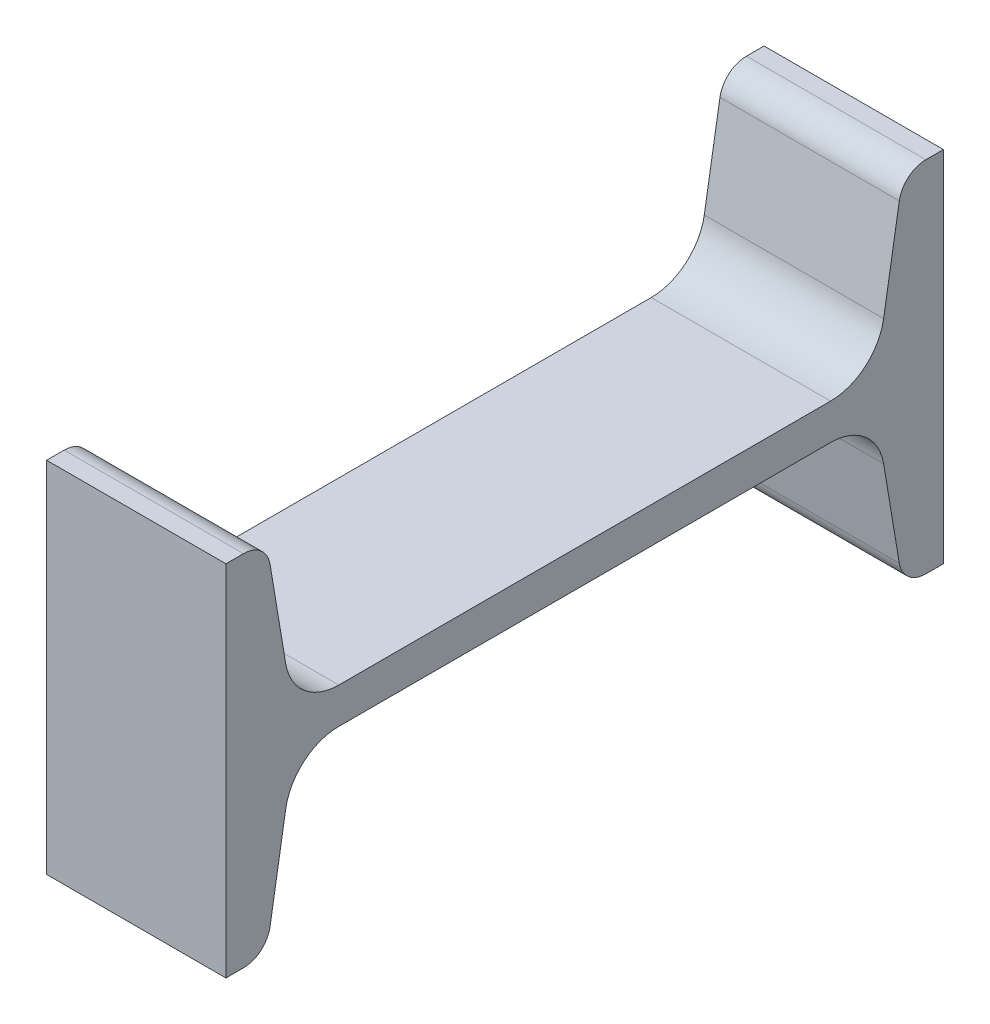
ISO-10303-21;
HEADER;
FILE_DESCRIPTION(('STEP AP214'),'2;1');
FILE_NAME('part.step','',(''),(''),'','','');
FILE_SCHEMA(('AUTOMOTIVE_DESIGN { 1 0 10303 214 1 1 1 1 }'));
ENDSEC;
DATA;
#1=APPLICATION_CONTEXT('core data for automotive mechanical design processes');
#2=APPLICATION_PROTOCOL_DEFINITION('international standard','automotive_design',2000,#1);
#3=PRODUCT_CONTEXT('',#1,'mechanical');
#4=PRODUCT('Part','Part','',(#3));
#5=PRODUCT_RELATED_PRODUCT_CATEGORY('part','',(#4));
#6=PRODUCT_DEFINITION_FORMATION('','',#4);
#7=PRODUCT_DEFINITION_CONTEXT('part definition',#1,'design');
#8=PRODUCT_DEFINITION('design','',#6,#7);
#9=PRODUCT_DEFINITION_SHAPE('','',#8);
#10=(LENGTH_UNIT() NAMED_UNIT(*) SI_UNIT(.MILLI.,.METRE.));
#11=(NAMED_UNIT(*) PLANE_ANGLE_UNIT() SI_UNIT($,.RADIAN.));
#12=(NAMED_UNIT(*) SI_UNIT($,.STERADIAN.) SOLID_ANGLE_UNIT());
#13=UNCERTAINTY_MEASURE_WITH_UNIT(LENGTH_MEASURE(1.E-05),#10,'distance_accuracy_value','');
#14=(GEOMETRIC_REPRESENTATION_CONTEXT(3) GLOBAL_UNCERTAINTY_ASSIGNED_CONTEXT((#13)) GLOBAL_UNIT_ASSIGNED_CONTEXT((#10,
#11,#12)) REPRESENTATION_CONTEXT('',''));
#15=CARTESIAN_POINT('',(0.,0.,0.));
#16=DIRECTION('',(0.,0.,1.));
#17=DIRECTION('',(1.,0.,0.));
#18=AXIS2_PLACEMENT_3D('',#15,#16,#17);
#19=CARTESIAN_POINT('',(20.,20.,-40.));
#20=DIRECTION('',(0.,0.,1.));
#21=DIRECTION('',(1.,0.,0.));
#22=AXIS2_PLACEMENT_3D('',#19,#20,#21);
#23=PLANE('',#22);
#24=DIRECTION('',(0.,1.,0.));
#25=VECTOR('',#24,1.);
#26=CARTESIAN_POINT('',(0.,20.,-40.));
#27=LINE('',#26,#25);
#28=CARTESIAN_POINT('',(0.,-20.,-40.));
#29=VERTEX_POINT('',#28);
#30=CARTESIAN_POINT('',(0.,20.,-40.));
#31=VERTEX_POINT('',#30);
#32=EDGE_CURVE('E266',#29,#31,#27,.T.);
#33=ORIENTED_EDGE('',*,*,#32,.T.);
#34=DIRECTION('',(-1.,0.,0.));
#35=VECTOR('',#34,1.);
#36=CARTESIAN_POINT('',(20.,20.,-40.));
#37=LINE('',#36,#35);
#38=CARTESIAN_POINT('',(20.,20.,-40.));
#39=VERTEX_POINT('',#38);
#40=EDGE_CURVE('E13',#39,#31,#37,.T.);
#41=ORIENTED_EDGE('',*,*,#40,.F.);
#42=DIRECTION('',(0.,1.,0.));
#43=VECTOR('',#42,1.);
#44=CARTESIAN_POINT('',(20.,20.,-40.));
#45=LINE('',#44,#43);
#46=CARTESIAN_POINT('',(20.,-20.,-40.));
#47=VERTEX_POINT('',#46);
#48=EDGE_CURVE('E304',#47,#39,#45,.T.);
#49=ORIENTED_EDGE('',*,*,#48,.F.);
#50=DIRECTION('',(-1.,0.,0.));
#51=VECTOR('',#50,1.);
#52=CARTESIAN_POINT('',(20.,-20.,-40.));
#53=LINE('',#52,#51);
#54=EDGE_CURVE('E262',#47,#29,#53,.T.);
#55=ORIENTED_EDGE('',*,*,#54,.T.);
#56=EDGE_LOOP('',(#33,#41,#49,#55));
#57=FACE_BOUND('',#56,.T.);
#58=ADVANCED_FACE('F98',(#57),#23,.F.);
#59=CARTESIAN_POINT('',(20.,20.,-38.0414602103931));
#60=DIRECTION('',(0.,-1.,0.));
#61=DIRECTION('',(0.,0.,-1.));
#62=AXIS2_PLACEMENT_3D('',#59,#60,#61);
#63=PLANE('',#62);
#64=DIRECTION('',(0.,0.,1.));
#65=VECTOR('',#64,1.);
#66=CARTESIAN_POINT('',(0.,20.,-38.0414602103931));
#67=LINE('',#66,#65);
#68=CARTESIAN_POINT('',(0.,20.,-38.0414602103931));
#69=VERTEX_POINT('',#68);
#70=EDGE_CURVE('E269',#31,#69,#67,.T.);
#71=ORIENTED_EDGE('',*,*,#70,.T.);
#72=DIRECTION('',(-1.,0.,0.));
#73=VECTOR('',#72,1.);
#74=CARTESIAN_POINT('',(20.,20.,-38.0414602103931));
#75=LINE('',#74,#73);
#76=CARTESIAN_POINT('',(20.,20.,-38.0414602103931));
#77=VERTEX_POINT('',#76);
#78=EDGE_CURVE('E106',#77,#69,#75,.T.);
#79=ORIENTED_EDGE('',*,*,#78,.F.);
#80=DIRECTION('',(0.,0.,1.));
#81=VECTOR('',#80,1.);
#82=CARTESIAN_POINT('',(20.,20.,-38.0414602103931));
#83=LINE('',#82,#81);
#84=EDGE_CURVE('E193',#39,#77,#83,.T.);
#85=ORIENTED_EDGE('',*,*,#84,.F.);
#86=ORIENTED_EDGE('',*,*,#40,.T.);
#87=EDGE_LOOP('',(#71,#79,#85,#86));
#88=FACE_BOUND('',#87,.T.);
#89=ADVANCED_FACE('F422',(#88),#63,.F.);
#90=CARTESIAN_POINT('',(20.,17.,-38.0414602103931));
#91=DIRECTION('',(-1.,0.,0.));
#92=DIRECTION('',(0.,0.,1.));
#93=AXIS2_PLACEMENT_3D('',#90,#91,#92);
#94=CYLINDRICAL_SURFACE('',#93,3.);
#95=CARTESIAN_POINT('',(0.,17.,-38.0414602103931));
#96=DIRECTION('',(1.,0.,0.));
#97=DIRECTION('',(0.,0.,-1.));
#98=AXIS2_PLACEMENT_3D('',#95,#96,#97);
#99=CIRCLE('',#98,3.);
#100=CARTESIAN_POINT('',(0.,17.4932319681189,-35.0822842734766));
#101=VERTEX_POINT('',#100);
#102=EDGE_CURVE('E271',#69,#101,#99,.T.);
#103=ORIENTED_EDGE('',*,*,#102,.T.);
#104=DIRECTION('',(-1.,0.,0.));
#105=VECTOR('',#104,1.);
#106=CARTESIAN_POINT('',(20.,17.4932319681189,-35.0822842734766));
#107=LINE('',#106,#105);
#108=CARTESIAN_POINT('',(20.,17.4932319681189,-35.0822842734766));
#109=VERTEX_POINT('',#108);
#110=EDGE_CURVE('E347',#109,#101,#107,.T.);
#111=ORIENTED_EDGE('',*,*,#110,.F.);
#112=CARTESIAN_POINT('',(20.,17.,-38.0414602103931));
#113=DIRECTION('',(1.,0.,0.));
#114=DIRECTION('',(0.,0.,-1.));
#115=AXIS2_PLACEMENT_3D('',#112,#113,#114);
#116=CIRCLE('',#115,3.);
#117=EDGE_CURVE('E355',#77,#109,#116,.T.);
#118=ORIENTED_EDGE('',*,*,#117,.F.);
#119=ORIENTED_EDGE('',*,*,#78,.T.);
#120=EDGE_LOOP('',(#103,#111,#118,#119));
#121=FACE_BOUND('',#120,.T.);
#122=ADVANCED_FACE('F353',(#121),#94,.T.);
#123=CARTESIAN_POINT('',(20.,7.01353606376226,-33.335540873833));
#124=DIRECTION('',(0.,-0.164410656039623,-0.986391978972163));
#125=DIRECTION('',(0.,0.986391978972163,-0.164410656039623));
#126=AXIS2_PLACEMENT_3D('',#123,#124,#125);
#127=PLANE('',#126);
#128=DIRECTION('',(0.,-0.986391978972163,0.164410656039623));
#129=VECTOR('',#128,1.);
#130=CARTESIAN_POINT('',(0.,7.01353606376226,-33.335540873833));
#131=LINE('',#130,#129);
#132=CARTESIAN_POINT('',(0.,7.01353606376226,-33.335540873833));
#133=VERTEX_POINT('',#132);
#134=EDGE_CURVE('E273',#101,#133,#131,.T.);
#135=ORIENTED_EDGE('',*,*,#134,.T.);
#136=DIRECTION('',(-1.,0.,0.));
#137=VECTOR('',#136,1.);
#138=CARTESIAN_POINT('',(20.,7.01353606376226,-33.335540873833));
#139=LINE('',#138,#137);
#140=CARTESIAN_POINT('',(20.,7.01353606376226,-33.335540873833));
#141=VERTEX_POINT('',#140);
#142=EDGE_CURVE('E344',#141,#133,#139,.T.);
#143=ORIENTED_EDGE('',*,*,#142,.F.);
#144=DIRECTION('',(0.,-0.986391978972163,0.164410656039623));
#145=VECTOR('',#144,1.);
#146=CARTESIAN_POINT('',(20.,7.01353606376226,-33.335540873833));
#147=LINE('',#146,#145);
#148=EDGE_CURVE('E373',#109,#141,#147,.T.);
#149=ORIENTED_EDGE('',*,*,#148,.F.);
#150=ORIENTED_EDGE('',*,*,#110,.T.);
#151=EDGE_LOOP('',(#135,#143,#149,#150));
#152=FACE_BOUND('',#151,.T.);
#153=ADVANCED_FACE('F364',(#152),#127,.F.);
#154=CARTESIAN_POINT('',(20.,8.,-27.417189));
#155=DIRECTION('',(-1.,0.,0.));
#156=DIRECTION('',(0.,0.,1.));
#157=AXIS2_PLACEMENT_3D('',#154,#155,#156);
#158=CYLINDRICAL_SURFACE('',#157,6.);
#159=CARTESIAN_POINT('',(0.,8.,-27.417189));
#160=DIRECTION('',(-1.,0.,0.));
#161=DIRECTION('',(0.,0.,-1.));
#162=AXIS2_PLACEMENT_3D('',#159,#160,#161);
#163=CIRCLE('',#162,6.);
#164=CARTESIAN_POINT('',(0.,2.,-27.417189));
#165=VERTEX_POINT('',#164);
#166=EDGE_CURVE('E275',#133,#165,#163,.T.);
#167=ORIENTED_EDGE('',*,*,#166,.T.);
#168=DIRECTION('',(-1.,0.,0.));
#169=VECTOR('',#168,1.);
#170=CARTESIAN_POINT('',(20.,2.,-27.417189));
#171=LINE('',#170,#169);
#172=CARTESIAN_POINT('',(20.,2.,-27.417189));
#173=VERTEX_POINT('',#172);
#174=EDGE_CURVE('E341',#173,#165,#171,.T.);
#175=ORIENTED_EDGE('',*,*,#174,.F.);
#176=CARTESIAN_POINT('',(20.,8.,-27.417189));
#177=DIRECTION('',(-1.,0.,0.));
#178=DIRECTION('',(0.,0.,-1.));
#179=AXIS2_PLACEMENT_3D('',#176,#177,#178);
#180=CIRCLE('',#179,6.);
#181=EDGE_CURVE('E370',#141,#173,#180,.T.);
#182=ORIENTED_EDGE('',*,*,#181,.F.);
#183=ORIENTED_EDGE('',*,*,#142,.T.);
#184=EDGE_LOOP('',(#167,#175,#182,#183));
#185=FACE_BOUND('',#184,.T.);
#186=ADVANCED_FACE('F368',(#185),#158,.F.);
#187=CARTESIAN_POINT('',(20.,2.,27.417189));
#188=DIRECTION('',(0.,-1.,0.));
#189=DIRECTION('',(0.,0.,-1.));
#190=AXIS2_PLACEMENT_3D('',#187,#188,#189);
#191=PLANE('',#190);
#192=DIRECTION('',(0.,0.,1.));
#193=VECTOR('',#192,1.);
#194=CARTESIAN_POINT('',(0.,2.,27.417189));
#195=LINE('',#194,#193);
#196=CARTESIAN_POINT('',(0.,2.,27.417189));
#197=VERTEX_POINT('',#196);
#198=EDGE_CURVE('E277',#165,#197,#195,.T.);
#199=ORIENTED_EDGE('',*,*,#198,.T.);
#200=DIRECTION('',(-1.,0.,0.));
#201=VECTOR('',#200,1.);
#202=CARTESIAN_POINT('',(20.,2.,27.417189));
#203=LINE('',#202,#201);
#204=CARTESIAN_POINT('',(20.,2.,27.417189));
#205=VERTEX_POINT('',#204);
#206=EDGE_CURVE('E338',#205,#197,#203,.T.);
#207=ORIENTED_EDGE('',*,*,#206,.F.);
#208=DIRECTION('',(0.,0.,1.));
#209=VECTOR('',#208,1.);
#210=CARTESIAN_POINT('',(20.,2.,27.417189));
#211=LINE('',#210,#209);
#212=EDGE_CURVE('E372',#173,#205,#211,.T.);
#213=ORIENTED_EDGE('',*,*,#212,.F.);
#214=ORIENTED_EDGE('',*,*,#174,.T.);
#215=EDGE_LOOP('',(#199,#207,#213,#214));
#216=FACE_BOUND('',#215,.T.);
#217=ADVANCED_FACE('F435',(#216),#191,.F.);
#218=CARTESIAN_POINT('',(20.,8.00000000000001,27.417189));
#219=DIRECTION('',(-1.,0.,0.));
#220=DIRECTION('',(0.,0.,1.));
#221=AXIS2_PLACEMENT_3D('',#218,#219,#220);
#222=CYLINDRICAL_SURFACE('',#221,6.);
#223=CARTESIAN_POINT('',(0.,8.00000000000001,27.417189));
#224=DIRECTION('',(-1.,0.,0.));
#225=DIRECTION('',(0.,0.,-1.));
#226=AXIS2_PLACEMENT_3D('',#223,#224,#225);
#227=CIRCLE('',#226,6.);
#228=CARTESIAN_POINT('',(0.,7.01353606376227,33.335540873833));
#229=VERTEX_POINT('',#228);
#230=EDGE_CURVE('E279',#197,#229,#227,.T.);
#231=ORIENTED_EDGE('',*,*,#230,.T.);
#232=DIRECTION('',(-1.,0.,0.));
#233=VECTOR('',#232,1.);
#234=CARTESIAN_POINT('',(20.,7.01353606376227,33.335540873833));
#235=LINE('',#234,#233);
#236=CARTESIAN_POINT('',(20.,7.01353606376227,33.335540873833));
#237=VERTEX_POINT('',#236);
#238=EDGE_CURVE('E335',#237,#229,#235,.T.);
#239=ORIENTED_EDGE('',*,*,#238,.F.);
#240=CARTESIAN_POINT('',(20.,8.00000000000001,27.417189));
#241=DIRECTION('',(-1.,0.,0.));
#242=DIRECTION('',(0.,0.,-1.));
#243=AXIS2_PLACEMENT_3D('',#240,#241,#242);
#244=CIRCLE('',#243,6.);
#245=EDGE_CURVE('E375',#205,#237,#244,.T.);
#246=ORIENTED_EDGE('',*,*,#245,.F.);
#247=ORIENTED_EDGE('',*,*,#206,.T.);
#248=EDGE_LOOP('',(#231,#239,#246,#247));
#249=FACE_BOUND('',#248,.T.);
#250=ADVANCED_FACE('F438',(#249),#222,.F.);
#251=CARTESIAN_POINT('',(20.,17.4932319681189,35.0822842734766));
#252=DIRECTION('',(0.,-0.164410656039622,0.986391978972163));
#253=DIRECTION('',(0.,-0.986391978972164,-0.164410656039622));
#254=AXIS2_PLACEMENT_3D('',#251,#252,#253);
#255=PLANE('',#254);
#256=DIRECTION('',(0.,0.986391978972163,0.164410656039622));
#257=VECTOR('',#256,1.);
#258=CARTESIAN_POINT('',(0.,17.4932319681189,35.0822842734766));
#259=LINE('',#258,#257);
#260=CARTESIAN_POINT('',(0.,17.4932319681189,35.0822842734766));
#261=VERTEX_POINT('',#260);
#262=EDGE_CURVE('E281',#229,#261,#259,.T.);
#263=ORIENTED_EDGE('',*,*,#262,.T.);
#264=DIRECTION('',(-1.,0.,0.));
#265=VECTOR('',#264,1.);
#266=CARTESIAN_POINT('',(20.,17.4932319681189,35.0822842734766));
#267=LINE('',#266,#265);
#268=CARTESIAN_POINT('',(20.,17.4932319681189,35.0822842734766));
#269=VERTEX_POINT('',#268);
#270=EDGE_CURVE('E332',#269,#261,#267,.T.);
#271=ORIENTED_EDGE('',*,*,#270,.F.);
#272=DIRECTION('',(0.,0.986391978972163,0.164410656039622));
#273=VECTOR('',#272,1.);
#274=CARTESIAN_POINT('',(20.,17.4932319681189,35.0822842734766));
#275=LINE('',#274,#273);
#276=EDGE_CURVE('E381',#237,#269,#275,.T.);
#277=ORIENTED_EDGE('',*,*,#276,.F.);
#278=ORIENTED_EDGE('',*,*,#238,.T.);
#279=EDGE_LOOP('',(#263,#271,#277,#278));
#280=FACE_BOUND('',#279,.T.);
#281=ADVANCED_FACE('F442',(#280),#255,.F.);
#282=CARTESIAN_POINT('',(20.,17.,38.0414602103931));
#283=DIRECTION('',(-1.,0.,0.));
#284=DIRECTION('',(0.,0.,1.));
#285=AXIS2_PLACEMENT_3D('',#282,#283,#284);
#286=CYLINDRICAL_SURFACE('',#285,3.);
#287=CARTESIAN_POINT('',(0.,17.,38.0414602103931));
#288=DIRECTION('',(1.,0.,0.));
#289=DIRECTION('',(0.,0.,-1.));
#290=AXIS2_PLACEMENT_3D('',#287,#288,#289);
#291=CIRCLE('',#290,3.);
#292=CARTESIAN_POINT('',(0.,20.,38.0414602103931));
#293=VERTEX_POINT('',#292);
#294=EDGE_CURVE('E283',#261,#293,#291,.T.);
#295=ORIENTED_EDGE('',*,*,#294,.T.);
#296=DIRECTION('',(-1.,0.,0.));
#297=VECTOR('',#296,1.);
#298=CARTESIAN_POINT('',(20.,20.,38.0414602103931));
#299=LINE('',#298,#297);
#300=CARTESIAN_POINT('',(20.,20.,38.0414602103931));
#301=VERTEX_POINT('',#300);
#302=EDGE_CURVE('E329',#301,#293,#299,.T.);
#303=ORIENTED_EDGE('',*,*,#302,.F.);
#304=CARTESIAN_POINT('',(20.,17.,38.0414602103931));
#305=DIRECTION('',(1.,0.,0.));
#306=DIRECTION('',(0.,0.,-1.));
#307=AXIS2_PLACEMENT_3D('',#304,#305,#306);
#308=CIRCLE('',#307,3.);
#309=EDGE_CURVE('E383',#269,#301,#308,.T.);
#310=ORIENTED_EDGE('',*,*,#309,.F.);
#311=ORIENTED_EDGE('',*,*,#270,.T.);
#312=EDGE_LOOP('',(#295,#303,#310,#311));
#313=FACE_BOUND('',#312,.T.);
#314=ADVANCED_FACE('F446',(#313),#286,.T.);
#315=CARTESIAN_POINT('',(20.,20.,40.));
#316=DIRECTION('',(0.,-1.,0.));
#317=DIRECTION('',(0.,0.,-1.));
#318=AXIS2_PLACEMENT_3D('',#315,#316,#317);
#319=PLANE('',#318);
#320=DIRECTION('',(0.,0.,1.));
#321=VECTOR('',#320,1.);
#322=CARTESIAN_POINT('',(0.,20.,40.));
#323=LINE('',#322,#321);
#324=CARTESIAN_POINT('',(0.,20.,40.));
#325=VERTEX_POINT('',#324);
#326=EDGE_CURVE('E285',#293,#325,#323,.T.);
#327=ORIENTED_EDGE('',*,*,#326,.T.);
#328=DIRECTION('',(-1.,0.,0.));
#329=VECTOR('',#328,1.);
#330=CARTESIAN_POINT('',(20.,20.,40.));
#331=LINE('',#330,#329);
#332=CARTESIAN_POINT('',(20.,20.,40.));
#333=VERTEX_POINT('',#332);
#334=EDGE_CURVE('E326',#333,#325,#331,.T.);
#335=ORIENTED_EDGE('',*,*,#334,.F.);
#336=DIRECTION('',(0.,0.,1.));
#337=VECTOR('',#336,1.);
#338=CARTESIAN_POINT('',(20.,20.,40.));
#339=LINE('',#338,#337);
#340=EDGE_CURVE('E385',#301,#333,#339,.T.);
#341=ORIENTED_EDGE('',*,*,#340,.F.);
#342=ORIENTED_EDGE('',*,*,#302,.T.);
#343=EDGE_LOOP('',(#327,#335,#341,#342));
#344=FACE_BOUND('',#343,.T.);
#345=ADVANCED_FACE('F450',(#344),#319,.F.);
#346=CARTESIAN_POINT('',(20.,-20.,40.));
#347=DIRECTION('',(0.,0.,-1.));
#348=DIRECTION('',(0.,1.,0.));
#349=AXIS2_PLACEMENT_3D('',#346,#347,#348);
#350=PLANE('',#349);
#351=DIRECTION('',(0.,-1.,0.));
#352=VECTOR('',#351,1.);
#353=CARTESIAN_POINT('',(0.,-20.,40.));
#354=LINE('',#353,#352);
#355=CARTESIAN_POINT('',(0.,-20.,40.));
#356=VERTEX_POINT('',#355);
#357=EDGE_CURVE('E287',#325,#356,#354,.T.);
#358=ORIENTED_EDGE('',*,*,#357,.T.);
#359=DIRECTION('',(-1.,0.,0.));
#360=VECTOR('',#359,1.);
#361=CARTESIAN_POINT('',(20.,-20.,40.));
#362=LINE('',#361,#360);
#363=CARTESIAN_POINT('',(20.,-20.,40.));
#364=VERTEX_POINT('',#363);
#365=EDGE_CURVE('E323',#364,#356,#362,.T.);
#366=ORIENTED_EDGE('',*,*,#365,.F.);
#367=DIRECTION('',(0.,-1.,0.));
#368=VECTOR('',#367,1.);
#369=CARTESIAN_POINT('',(20.,-20.,40.));
#370=LINE('',#369,#368);
#371=EDGE_CURVE('E387',#333,#364,#370,.T.);
#372=ORIENTED_EDGE('',*,*,#371,.F.);
#373=ORIENTED_EDGE('',*,*,#334,.T.);
#374=EDGE_LOOP('',(#358,#366,#372,#373));
#375=FACE_BOUND('',#374,.T.);
#376=ADVANCED_FACE('F454',(#375),#350,.F.);
#377=CARTESIAN_POINT('',(20.,-20.,38.0414602103931));
#378=DIRECTION('',(0.,1.,0.));
#379=DIRECTION('',(0.,0.,1.));
#380=AXIS2_PLACEMENT_3D('',#377,#378,#379);
#381=PLANE('',#380);
#382=DIRECTION('',(0.,0.,-1.));
#383=VECTOR('',#382,1.);
#384=CARTESIAN_POINT('',(0.,-20.,38.0414602103931));
#385=LINE('',#384,#383);
#386=CARTESIAN_POINT('',(0.,-20.,38.0414602103931));
#387=VERTEX_POINT('',#386);
#388=EDGE_CURVE('E289',#356,#387,#385,.T.);
#389=ORIENTED_EDGE('',*,*,#388,.T.);
#390=DIRECTION('',(-1.,0.,0.));
#391=VECTOR('',#390,1.);
#392=CARTESIAN_POINT('',(20.,-20.,38.0414602103931));
#393=LINE('',#392,#391);
#394=CARTESIAN_POINT('',(20.,-20.,38.0414602103931));
#395=VERTEX_POINT('',#394);
#396=EDGE_CURVE('E320',#395,#387,#393,.T.);
#397=ORIENTED_EDGE('',*,*,#396,.F.);
#398=DIRECTION('',(0.,0.,-1.));
#399=VECTOR('',#398,1.);
#400=CARTESIAN_POINT('',(20.,-20.,38.0414602103931));
#401=LINE('',#400,#399);
#402=EDGE_CURVE('E389',#364,#395,#401,.T.);
#403=ORIENTED_EDGE('',*,*,#402,.F.);
#404=ORIENTED_EDGE('',*,*,#365,.T.);
#405=EDGE_LOOP('',(#389,#397,#403,#404));
#406=FACE_BOUND('',#405,.T.);
#407=ADVANCED_FACE('F458',(#406),#381,.F.);
#408=CARTESIAN_POINT('',(20.,-17.,38.0414602103931));
#409=DIRECTION('',(-1.,0.,0.));
#410=DIRECTION('',(0.,0.,1.));
#411=AXIS2_PLACEMENT_3D('',#408,#409,#410);
#412=CYLINDRICAL_SURFACE('',#411,3.);
#413=CARTESIAN_POINT('',(0.,-17.,38.0414602103931));
#414=DIRECTION('',(1.,0.,0.));
#415=DIRECTION('',(0.,0.,1.));
#416=AXIS2_PLACEMENT_3D('',#413,#414,#415);
#417=CIRCLE('',#416,3.);
#418=CARTESIAN_POINT('',(0.,-17.4932319681189,35.0822842734766));
#419=VERTEX_POINT('',#418);
#420=EDGE_CURVE('E291',#387,#419,#417,.T.);
#421=ORIENTED_EDGE('',*,*,#420,.T.);
#422=DIRECTION('',(-1.,0.,0.));
#423=VECTOR('',#422,1.);
#424=CARTESIAN_POINT('',(20.,-17.4932319681189,35.0822842734766));
#425=LINE('',#424,#423);
#426=CARTESIAN_POINT('',(20.,-17.4932319681189,35.0822842734766));
#427=VERTEX_POINT('',#426);
#428=EDGE_CURVE('E317',#427,#419,#425,.T.);
#429=ORIENTED_EDGE('',*,*,#428,.F.);
#430=CARTESIAN_POINT('',(20.,-17.,38.0414602103931));
#431=DIRECTION('',(1.,0.,0.));
#432=DIRECTION('',(0.,0.,1.));
#433=AXIS2_PLACEMENT_3D('',#430,#431,#432);
#434=CIRCLE('',#433,3.);
#435=EDGE_CURVE('E391',#395,#427,#434,.T.);
#436=ORIENTED_EDGE('',*,*,#435,.F.);
#437=ORIENTED_EDGE('',*,*,#396,.T.);
#438=EDGE_LOOP('',(#421,#429,#436,#437));
#439=FACE_BOUND('',#438,.T.);
#440=ADVANCED_FACE('F462',(#439),#412,.T.);
#441=CARTESIAN_POINT('',(20.,-7.01353606376226,33.335540873833));
#442=DIRECTION('',(0.,0.164410656039623,0.986391978972163));
#443=DIRECTION('',(0.,-0.986391978972163,0.164410656039623));
#444=AXIS2_PLACEMENT_3D('',#441,#442,#443);
#445=PLANE('',#444);
#446=DIRECTION('',(0.,0.986391978972163,-0.164410656039623));
#447=VECTOR('',#446,1.);
#448=CARTESIAN_POINT('',(0.,-7.01353606376226,33.335540873833));
#449=LINE('',#448,#447);
#450=CARTESIAN_POINT('',(0.,-7.01353606376226,33.335540873833));
#451=VERTEX_POINT('',#450);
#452=EDGE_CURVE('E293',#419,#451,#449,.T.);
#453=ORIENTED_EDGE('',*,*,#452,.T.);
#454=DIRECTION('',(-1.,0.,0.));
#455=VECTOR('',#454,1.);
#456=CARTESIAN_POINT('',(20.,-7.01353606376226,33.335540873833));
#457=LINE('',#456,#455);
#458=CARTESIAN_POINT('',(20.,-7.01353606376226,33.335540873833));
#459=VERTEX_POINT('',#458);
#460=EDGE_CURVE('E314',#459,#451,#457,.T.);
#461=ORIENTED_EDGE('',*,*,#460,.F.);
#462=DIRECTION('',(0.,0.986391978972163,-0.164410656039623));
#463=VECTOR('',#462,1.);
#464=CARTESIAN_POINT('',(20.,-7.01353606376226,33.335540873833));
#465=LINE('',#464,#463);
#466=EDGE_CURVE('E393',#427,#459,#465,.T.);
#467=ORIENTED_EDGE('',*,*,#466,.F.);
#468=ORIENTED_EDGE('',*,*,#428,.T.);
#469=EDGE_LOOP('',(#453,#461,#467,#468));
#470=FACE_BOUND('',#469,.T.);
#471=ADVANCED_FACE('F466',(#470),#445,.F.);
#472=CARTESIAN_POINT('',(20.,-7.99999999999999,27.417189));
#473=DIRECTION('',(-1.,0.,0.));
#474=DIRECTION('',(0.,0.,1.));
#475=AXIS2_PLACEMENT_3D('',#472,#473,#474);
#476=CYLINDRICAL_SURFACE('',#475,6.);
#477=CARTESIAN_POINT('',(0.,-7.99999999999999,27.417189));
#478=DIRECTION('',(-1.,0.,0.));
#479=DIRECTION('',(0.,0.,-1.));
#480=AXIS2_PLACEMENT_3D('',#477,#478,#479);
#481=CIRCLE('',#480,6.);
#482=CARTESIAN_POINT('',(0.,-2.,27.417189));
#483=VERTEX_POINT('',#482);
#484=EDGE_CURVE('E295',#451,#483,#481,.T.);
#485=ORIENTED_EDGE('',*,*,#484,.T.);
#486=DIRECTION('',(-1.,0.,0.));
#487=VECTOR('',#486,1.);
#488=CARTESIAN_POINT('',(20.,-2.,27.417189));
#489=LINE('',#488,#487);
#490=CARTESIAN_POINT('',(20.,-2.,27.417189));
#491=VERTEX_POINT('',#490);
#492=EDGE_CURVE('E311',#491,#483,#489,.T.);
#493=ORIENTED_EDGE('',*,*,#492,.F.);
#494=CARTESIAN_POINT('',(20.,-7.99999999999999,27.417189));
#495=DIRECTION('',(-1.,0.,0.));
#496=DIRECTION('',(0.,0.,-1.));
#497=AXIS2_PLACEMENT_3D('',#494,#495,#496);
#498=CIRCLE('',#497,6.);
#499=EDGE_CURVE('E395',#459,#491,#498,.T.);
#500=ORIENTED_EDGE('',*,*,#499,.F.);
#501=ORIENTED_EDGE('',*,*,#460,.T.);
#502=EDGE_LOOP('',(#485,#493,#500,#501));
#503=FACE_BOUND('',#502,.T.);
#504=ADVANCED_FACE('F470',(#503),#476,.F.);
#505=CARTESIAN_POINT('',(20.,-2.,-27.417189));
#506=DIRECTION('',(0.,1.,0.));
#507=DIRECTION('',(0.,0.,1.));
#508=AXIS2_PLACEMENT_3D('',#505,#506,#507);
#509=PLANE('',#508);
#510=DIRECTION('',(0.,0.,-1.));
#511=VECTOR('',#510,1.);
#512=CARTESIAN_POINT('',(0.,-2.,-27.417189));
#513=LINE('',#512,#511);
#514=CARTESIAN_POINT('',(0.,-2.,-27.417189));
#515=VERTEX_POINT('',#514);
#516=EDGE_CURVE('E297',#483,#515,#513,.T.);
#517=ORIENTED_EDGE('',*,*,#516,.T.);
#518=DIRECTION('',(-1.,0.,0.));
#519=VECTOR('',#518,1.);
#520=CARTESIAN_POINT('',(20.,-2.,-27.417189));
#521=LINE('',#520,#519);
#522=CARTESIAN_POINT('',(20.,-2.,-27.417189));
#523=VERTEX_POINT('',#522);
#524=EDGE_CURVE('E308',#523,#515,#521,.T.);
#525=ORIENTED_EDGE('',*,*,#524,.F.);
#526=DIRECTION('',(0.,0.,-1.));
#527=VECTOR('',#526,1.);
#528=CARTESIAN_POINT('',(20.,-2.,-27.417189));
#529=LINE('',#528,#527);
#530=EDGE_CURVE('E397',#491,#523,#529,.T.);
#531=ORIENTED_EDGE('',*,*,#530,.F.);
#532=ORIENTED_EDGE('',*,*,#492,.T.);
#533=EDGE_LOOP('',(#517,#525,#531,#532));
#534=FACE_BOUND('',#533,.T.);
#535=ADVANCED_FACE('F403',(#534),#509,.F.);
#536=CARTESIAN_POINT('',(20.,-8.,-27.417189));
#537=DIRECTION('',(-1.,0.,0.));
#538=DIRECTION('',(0.,0.,1.));
#539=AXIS2_PLACEMENT_3D('',#536,#537,#538);
#540=CYLINDRICAL_SURFACE('',#539,6.);
#541=CARTESIAN_POINT('',(0.,-8.,-27.417189));
#542=DIRECTION('',(-1.,0.,0.));
#543=DIRECTION('',(0.,0.,-1.));
#544=AXIS2_PLACEMENT_3D('',#541,#542,#543);
#545=CIRCLE('',#544,6.);
#546=CARTESIAN_POINT('',(0.,-7.01353606376226,-33.335540873833));
#547=VERTEX_POINT('',#546);
#548=EDGE_CURVE('E299',#515,#547,#545,.T.);
#549=ORIENTED_EDGE('',*,*,#548,.T.);
#550=DIRECTION('',(-1.,0.,0.));
#551=VECTOR('',#550,1.);
#552=CARTESIAN_POINT('',(20.,-7.01353606376226,-33.335540873833));
#553=LINE('',#552,#551);
#554=CARTESIAN_POINT('',(20.,-7.01353606376226,-33.335540873833));
#555=VERTEX_POINT('',#554);
#556=EDGE_CURVE('E257',#555,#547,#553,.T.);
#557=ORIENTED_EDGE('',*,*,#556,.F.);
#558=CARTESIAN_POINT('',(20.,-8.,-27.417189));
#559=DIRECTION('',(-1.,0.,0.));
#560=DIRECTION('',(0.,0.,-1.));
#561=AXIS2_PLACEMENT_3D('',#558,#559,#560);
#562=CIRCLE('',#561,6.);
#563=EDGE_CURVE('E248',#523,#555,#562,.T.);
#564=ORIENTED_EDGE('',*,*,#563,.F.);
#565=ORIENTED_EDGE('',*,*,#524,.T.);
#566=EDGE_LOOP('',(#549,#557,#564,#565));
#567=FACE_BOUND('',#566,.T.);
#568=ADVANCED_FACE('F407',(#567),#540,.F.);
#569=CARTESIAN_POINT('',(20.,-17.4932319681189,-35.0822842734766));
#570=DIRECTION('',(0.,0.164410656039623,-0.986391978972163));
#571=DIRECTION('',(0.,0.986391978972163,0.164410656039623));
#572=AXIS2_PLACEMENT_3D('',#569,#570,#571);
#573=PLANE('',#572);
#574=DIRECTION('',(0.,-0.986391978972163,-0.164410656039623));
#575=VECTOR('',#574,1.);
#576=CARTESIAN_POINT('',(0.,-17.4932319681189,-35.0822842734766));
#577=LINE('',#576,#575);
#578=CARTESIAN_POINT('',(0.,-17.4932319681189,-35.0822842734766));
#579=VERTEX_POINT('',#578);
#580=EDGE_CURVE('E256',#547,#579,#577,.T.);
#581=ORIENTED_EDGE('',*,*,#580,.T.);
#582=DIRECTION('',(-1.,0.,0.));
#583=VECTOR('',#582,1.);
#584=CARTESIAN_POINT('',(20.,-17.4932319681189,-35.0822842734766));
#585=LINE('',#584,#583);
#586=CARTESIAN_POINT('',(20.,-17.4932319681189,-35.0822842734766));
#587=VERTEX_POINT('',#586);
#588=EDGE_CURVE('E253',#587,#579,#585,.T.);
#589=ORIENTED_EDGE('',*,*,#588,.F.);
#590=DIRECTION('',(0.,-0.986391978972163,-0.164410656039623));
#591=VECTOR('',#590,1.);
#592=CARTESIAN_POINT('',(20.,-17.4932319681189,-35.0822842734766));
#593=LINE('',#592,#591);
#594=EDGE_CURVE('E242',#555,#587,#593,.T.);
#595=ORIENTED_EDGE('',*,*,#594,.F.);
#596=ORIENTED_EDGE('',*,*,#556,.T.);
#597=EDGE_LOOP('',(#581,#589,#595,#596));
#598=FACE_BOUND('',#597,.T.);
#599=ADVANCED_FACE('F254',(#598),#573,.F.);
#600=CARTESIAN_POINT('',(20.,-17.,-38.0414602103931));
#601=DIRECTION('',(-1.,0.,0.));
#602=DIRECTION('',(0.,0.,1.));
#603=AXIS2_PLACEMENT_3D('',#600,#601,#602);
#604=CYLINDRICAL_SURFACE('',#603,3.);
#605=CARTESIAN_POINT('',(0.,-17.,-38.0414602103931));
#606=DIRECTION('',(1.,0.,0.));
#607=DIRECTION('',(0.,0.,1.));
#608=AXIS2_PLACEMENT_3D('',#605,#606,#607);
#609=CIRCLE('',#608,3.);
#610=CARTESIAN_POINT('',(0.,-20.,-38.0414602103931));
#611=VERTEX_POINT('',#610);
#612=EDGE_CURVE('E179',#579,#611,#609,.T.);
#613=ORIENTED_EDGE('',*,*,#612,.T.);
#614=DIRECTION('',(-1.,0.,0.));
#615=VECTOR('',#614,1.);
#616=CARTESIAN_POINT('',(20.,-20.,-38.0414602103931));
#617=LINE('',#616,#615);
#618=CARTESIAN_POINT('',(20.,-20.,-38.0414602103931));
#619=VERTEX_POINT('',#618);
#620=EDGE_CURVE('E258',#619,#611,#617,.T.);
#621=ORIENTED_EDGE('',*,*,#620,.F.);
#622=CARTESIAN_POINT('',(20.,-17.,-38.0414602103931));
#623=DIRECTION('',(1.,0.,0.));
#624=DIRECTION('',(0.,0.,1.));
#625=AXIS2_PLACEMENT_3D('',#622,#623,#624);
#626=CIRCLE('',#625,3.);
#627=EDGE_CURVE('E246',#587,#619,#626,.T.);
#628=ORIENTED_EDGE('',*,*,#627,.F.);
#629=ORIENTED_EDGE('',*,*,#588,.T.);
#630=EDGE_LOOP('',(#613,#621,#628,#629));
#631=FACE_BOUND('',#630,.T.);
#632=ADVANCED_FACE('F260',(#631),#604,.T.);
#633=CARTESIAN_POINT('',(20.,-20.,-40.));
#634=DIRECTION('',(0.,1.,0.));
#635=DIRECTION('',(0.,0.,1.));
#636=AXIS2_PLACEMENT_3D('',#633,#634,#635);
#637=PLANE('',#636);
#638=DIRECTION('',(0.,0.,-1.));
#639=VECTOR('',#638,1.);
#640=CARTESIAN_POINT('',(0.,-20.,-40.));
#641=LINE('',#640,#639);
#642=EDGE_CURVE('E185',#611,#29,#641,.T.);
#643=ORIENTED_EDGE('',*,*,#642,.T.);
#644=ORIENTED_EDGE('',*,*,#54,.F.);
#645=DIRECTION('',(0.,0.,-1.));
#646=VECTOR('',#645,1.);
#647=CARTESIAN_POINT('',(20.,-20.,-40.));
#648=LINE('',#647,#646);
#649=EDGE_CURVE('E114',#619,#47,#648,.T.);
#650=ORIENTED_EDGE('',*,*,#649,.F.);
#651=ORIENTED_EDGE('',*,*,#620,.T.);
#652=EDGE_LOOP('',(#643,#644,#650,#651));
#653=FACE_BOUND('',#652,.T.);
#654=ADVANCED_FACE('F411',(#653),#637,.F.);
#655=CARTESIAN_POINT('',(20.,-17.,-38.0414602103931));
#656=DIRECTION('',(-1.,0.,0.));
#657=DIRECTION('',(0.,0.,1.));
#658=AXIS2_PLACEMENT_3D('',#655,#656,#657);
#659=PLANE('',#658);
#660=ORIENTED_EDGE('',*,*,#48,.T.);
#661=ORIENTED_EDGE('',*,*,#84,.T.);
#662=ORIENTED_EDGE('',*,*,#117,.T.);
#663=ORIENTED_EDGE('',*,*,#148,.T.);
#664=ORIENTED_EDGE('',*,*,#181,.T.);
#665=ORIENTED_EDGE('',*,*,#212,.T.);
#666=ORIENTED_EDGE('',*,*,#245,.T.);
#667=ORIENTED_EDGE('',*,*,#276,.T.);
#668=ORIENTED_EDGE('',*,*,#309,.T.);
#669=ORIENTED_EDGE('',*,*,#340,.T.);
#670=ORIENTED_EDGE('',*,*,#371,.T.);
#671=ORIENTED_EDGE('',*,*,#402,.T.);
#672=ORIENTED_EDGE('',*,*,#435,.T.);
#673=ORIENTED_EDGE('',*,*,#466,.T.);
#674=ORIENTED_EDGE('',*,*,#499,.T.);
#675=ORIENTED_EDGE('',*,*,#530,.T.);
#676=ORIENTED_EDGE('',*,*,#563,.T.);
#677=ORIENTED_EDGE('',*,*,#594,.T.);
#678=ORIENTED_EDGE('',*,*,#627,.T.);
#679=ORIENTED_EDGE('',*,*,#649,.T.);
#680=EDGE_LOOP('',(#660,#661,#662,#663,#664,#665,#666,#667,#668,#669,#670,#671,#672,#673,#674,
#675,#676,#677,#678,#679));
#681=FACE_BOUND('',#680,.T.);
#682=ADVANCED_FACE('F244',(#681),#659,.F.);
#683=CARTESIAN_POINT('',(0.,-17.,-38.0414602103931));
#684=DIRECTION('',(-1.,0.,0.));
#685=DIRECTION('',(0.,0.,1.));
#686=AXIS2_PLACEMENT_3D('',#683,#684,#685);
#687=PLANE('',#686);
#688=ORIENTED_EDGE('',*,*,#32,.F.);
#689=ORIENTED_EDGE('',*,*,#642,.F.);
#690=ORIENTED_EDGE('',*,*,#612,.F.);
#691=ORIENTED_EDGE('',*,*,#580,.F.);
#692=ORIENTED_EDGE('',*,*,#548,.F.);
#693=ORIENTED_EDGE('',*,*,#516,.F.);
#694=ORIENTED_EDGE('',*,*,#484,.F.);
#695=ORIENTED_EDGE('',*,*,#452,.F.);
#696=ORIENTED_EDGE('',*,*,#420,.F.);
#697=ORIENTED_EDGE('',*,*,#388,.F.);
#698=ORIENTED_EDGE('',*,*,#357,.F.);
#699=ORIENTED_EDGE('',*,*,#326,.F.);
#700=ORIENTED_EDGE('',*,*,#294,.F.);
#701=ORIENTED_EDGE('',*,*,#262,.F.);
#702=ORIENTED_EDGE('',*,*,#230,.F.);
#703=ORIENTED_EDGE('',*,*,#198,.F.);
#704=ORIENTED_EDGE('',*,*,#166,.F.);
#705=ORIENTED_EDGE('',*,*,#134,.F.);
#706=ORIENTED_EDGE('',*,*,#102,.F.);
#707=ORIENTED_EDGE('',*,*,#70,.F.);
#708=EDGE_LOOP('',(#688,#689,#690,#691,#692,#693,#694,#695,#696,#697,#698,#699,#700,#701,#702,
#703,#704,#705,#706,#707));
#709=FACE_BOUND('',#708,.T.);
#710=ADVANCED_FACE('F359',(#709),#687,.T.);
#711=CLOSED_SHELL('',(#58,#89,#122,#153,#186,#217,#250,#281,#314,#345,#376,#407,#440,#471,#504,
#535,#568,#599,#632,#654,#682,#710));
#712=MANIFOLD_SOLID_BREP('B2',#711);
#713=ADVANCED_BREP_SHAPE_REPRESENTATION('',(#18,#712),#14);
#714=SHAPE_DEFINITION_REPRESENTATION(#9,#713);
ENDSEC;
END-ISO-10303-21;
